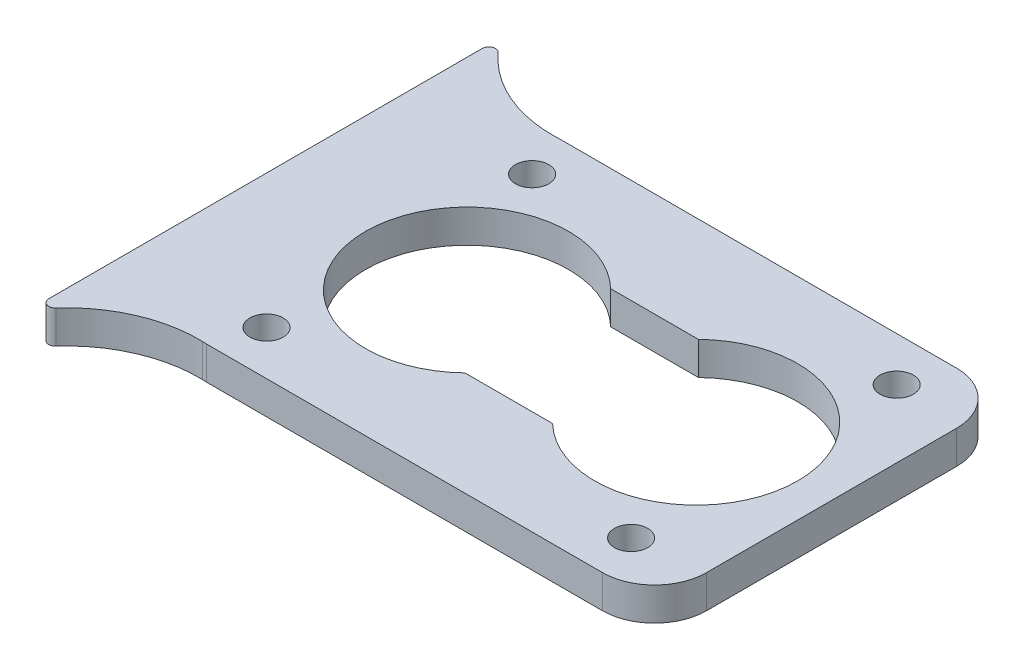
ISO-10303-21;
HEADER;
FILE_DESCRIPTION(('STEP AP214'),'2;1');
FILE_NAME('part.step','',(''),(''),'','','');
FILE_SCHEMA(('AUTOMOTIVE_DESIGN { 1 0 10303 214 1 1 1 1 }'));
ENDSEC;
DATA;
#1=APPLICATION_CONTEXT('core data for automotive mechanical design processes');
#2=APPLICATION_PROTOCOL_DEFINITION('international standard','automotive_design',2000,#1);
#3=PRODUCT_CONTEXT('',#1,'mechanical');
#4=PRODUCT('Part','Part','',(#3));
#5=PRODUCT_RELATED_PRODUCT_CATEGORY('part','',(#4));
#6=PRODUCT_DEFINITION_FORMATION('','',#4);
#7=PRODUCT_DEFINITION_CONTEXT('part definition',#1,'design');
#8=PRODUCT_DEFINITION('design','',#6,#7);
#9=PRODUCT_DEFINITION_SHAPE('','',#8);
#10=(LENGTH_UNIT() NAMED_UNIT(*) SI_UNIT(.MILLI.,.METRE.));
#11=(NAMED_UNIT(*) PLANE_ANGLE_UNIT() SI_UNIT($,.RADIAN.));
#12=(NAMED_UNIT(*) SI_UNIT($,.STERADIAN.) SOLID_ANGLE_UNIT());
#13=UNCERTAINTY_MEASURE_WITH_UNIT(LENGTH_MEASURE(1.E-05),#10,'distance_accuracy_value','');
#14=(GEOMETRIC_REPRESENTATION_CONTEXT(3) GLOBAL_UNCERTAINTY_ASSIGNED_CONTEXT((#13)) GLOBAL_UNIT_ASSIGNED_CONTEXT((#10,
#11,#12)) REPRESENTATION_CONTEXT('',''));
#15=CARTESIAN_POINT('',(0.,0.,0.));
#16=DIRECTION('',(0.,0.,1.));
#17=DIRECTION('',(1.,0.,0.));
#18=AXIS2_PLACEMENT_3D('',#15,#16,#17);
#19=CARTESIAN_POINT('',(-157.734622519799,3.175,-39.7034866419941));
#20=DIRECTION('',(0.,-1.,0.));
#21=DIRECTION('',(0.,0.,-1.));
#22=AXIS2_PLACEMENT_3D('',#19,#20,#21);
#23=CYLINDRICAL_SURFACE('',#22,5.);
#24=DIRECTION('',(0.,-1.,0.));
#25=VECTOR('',#24,1.);
#26=CARTESIAN_POINT('',(-158.159635896078,3.175,-34.7215830269105));
#27=LINE('',#26,#25);
#28=CARTESIAN_POINT('',(-158.159635896078,3.175,-34.7215830269105));
#29=VERTEX_POINT('',#28);
#30=CARTESIAN_POINT('',(-158.159635896078,0.,-34.7215830269105));
#31=VERTEX_POINT('',#30);
#32=EDGE_CURVE('E154',#29,#31,#27,.T.);
#33=ORIENTED_EDGE('',*,*,#32,.T.);
#34=CARTESIAN_POINT('',(-157.734622519799,0.,-39.7034866419941));
#35=DIRECTION('',(0.,1.,0.));
#36=DIRECTION('',(0.,0.,1.));
#37=AXIS2_PLACEMENT_3D('',#34,#35,#36);
#38=CIRCLE('',#37,5.);
#39=CARTESIAN_POINT('',(-157.734622519799,0.,-34.7034866419941));
#40=VERTEX_POINT('',#39);
#41=EDGE_CURVE('E160',#31,#40,#38,.T.);
#42=ORIENTED_EDGE('',*,*,#41,.T.);
#43=DIRECTION('',(0.,-1.,0.));
#44=VECTOR('',#43,1.);
#45=CARTESIAN_POINT('',(-157.734622519799,3.175,-34.7034866419941));
#46=LINE('',#45,#44);
#47=CARTESIAN_POINT('',(-157.734622519799,3.175,-34.7034866419941));
#48=VERTEX_POINT('',#47);
#49=EDGE_CURVE('E264',#48,#40,#46,.T.);
#50=ORIENTED_EDGE('',*,*,#49,.F.);
#51=CARTESIAN_POINT('',(-157.734622519799,3.175,-39.7034866419941));
#52=DIRECTION('',(0.,1.,0.));
#53=DIRECTION('',(0.,0.,1.));
#54=AXIS2_PLACEMENT_3D('',#51,#52,#53);
#55=CIRCLE('',#54,5.);
#56=EDGE_CURVE('E172',#29,#48,#55,.T.);
#57=ORIENTED_EDGE('',*,*,#56,.F.);
#58=EDGE_LOOP('',(#33,#42,#50,#57));
#59=FACE_BOUND('',#58,.T.);
#60=ADVANCED_FACE('F35',(#59),#23,.T.);
#61=CARTESIAN_POINT('',(-119.734622519799,3.175,-39.7034866419941));
#62=DIRECTION('',(0.,1.,0.));
#63=DIRECTION('',(0.,0.,1.));
#64=AXIS2_PLACEMENT_3D('',#61,#62,#63);
#65=PLANE('',#64);
#66=DIRECTION('',(-1.,0.,0.));
#67=VECTOR('',#66,1.);
#68=CARTESIAN_POINT('',(-142.94768653955,3.175,-58.7034866419942));
#69=LINE('',#68,#67);
#70=CARTESIAN_POINT('',(-134.521558500048,3.175,-58.7034866419942));
#71=VERTEX_POINT('',#70);
#72=CARTESIAN_POINT('',(-142.94768653955,3.175,-58.7034866419941));
#73=VERTEX_POINT('',#72);
#74=EDGE_CURVE('E208',#71,#73,#69,.T.);
#75=ORIENTED_EDGE('',*,*,#74,.F.);
#76=CARTESIAN_POINT('',(-127.734622519799,3.175,-51.7034866419941));
#77=DIRECTION('',(0.,1.,0.));
#78=DIRECTION('',(0.,0.,1.));
#79=AXIS2_PLACEMENT_3D('',#76,#77,#78);
#80=CIRCLE('',#79,9.75);
#81=CARTESIAN_POINT('',(-134.521558500048,3.175,-44.7034866419941));
#82=VERTEX_POINT('',#81);
#83=EDGE_CURVE('E206',#82,#71,#80,.T.);
#84=ORIENTED_EDGE('',*,*,#83,.F.);
#85=DIRECTION('',(1.,0.,0.));
#86=VECTOR('',#85,1.);
#87=CARTESIAN_POINT('',(-134.521558500048,3.175,-44.7034866419941));
#88=LINE('',#87,#86);
#89=CARTESIAN_POINT('',(-142.94768653955,3.175,-44.7034866419941));
#90=VERTEX_POINT('',#89);
#91=EDGE_CURVE('E213',#90,#82,#88,.T.);
#92=ORIENTED_EDGE('',*,*,#91,.F.);
#93=CARTESIAN_POINT('',(-149.734622519799,3.175,-51.7034866419941));
#94=DIRECTION('',(0.,1.,0.));
#95=DIRECTION('',(0.,0.,1.));
#96=AXIS2_PLACEMENT_3D('',#93,#94,#95);
#97=CIRCLE('',#96,9.74999999999999);
#98=EDGE_CURVE('E211',#73,#90,#97,.T.);
#99=ORIENTED_EDGE('',*,*,#98,.F.);
#100=EDGE_LOOP('',(#75,#84,#92,#99));
#101=FACE_BOUND('',#100,.T.);
#102=CARTESIAN_POINT('',(-158.487309476485,3.175,-81.3811623889611));
#103=DIRECTION('',(0.,-1.,0.));
#104=DIRECTION('',(0.,0.,-1.));
#105=AXIS2_PLACEMENT_3D('',#102,#103,#104);
#106=CIRCLE('',#105,12.7);
#107=CARTESIAN_POINT('',(-167.975226660594,3.175,-72.9390401731027));
#108=VERTEX_POINT('',#107);
#109=CARTESIAN_POINT('',(-158.159635896078,3.175,-68.6853902570779));
#110=VERTEX_POINT('',#109);
#111=EDGE_CURVE('E174',#108,#110,#106,.F.);
#112=ORIENTED_EDGE('',*,*,#111,.F.);
#113=CARTESIAN_POINT('',(-168.449622519799,3.175,-72.5169340623098));
#114=DIRECTION('',(0.,1.,0.));
#115=DIRECTION('',(0.,0.,1.));
#116=AXIS2_PLACEMENT_3D('',#113,#114,#115);
#117=CIRCLE('',#116,0.635);
#118=CARTESIAN_POINT('',(-169.084622519799,3.175,-72.5169340623098));
#119=VERTEX_POINT('',#118);
#120=EDGE_CURVE('E43',#108,#119,#117,.T.);
#121=ORIENTED_EDGE('',*,*,#120,.T.);
#122=DIRECTION('',(0.,0.,1.));
#123=VECTOR('',#122,1.);
#124=CARTESIAN_POINT('',(-169.084622519799,3.175,-1.03468456448365E-13));
#125=LINE('',#124,#123);
#126=CARTESIAN_POINT('',(-169.084622519799,3.175,-30.8900392216785));
#127=VERTEX_POINT('',#126);
#128=EDGE_CURVE('E179',#119,#127,#125,.T.);
#129=ORIENTED_EDGE('',*,*,#128,.T.);
#130=CARTESIAN_POINT('',(-168.449622519799,3.175,-30.8900392216785));
#131=DIRECTION('',(0.,1.,0.));
#132=DIRECTION('',(0.,0.,1.));
#133=AXIS2_PLACEMENT_3D('',#130,#131,#132);
#134=CIRCLE('',#133,0.635);
#135=CARTESIAN_POINT('',(-167.975226660594,3.175,-30.4679331108856));
#136=VERTEX_POINT('',#135);
#137=EDGE_CURVE('E50',#127,#136,#134,.T.);
#138=ORIENTED_EDGE('',*,*,#137,.T.);
#139=CARTESIAN_POINT('',(-158.487309476485,3.175,-22.0258108950272));
#140=DIRECTION('',(0.,-1.,0.));
#141=DIRECTION('',(0.,0.,-1.));
#142=AXIS2_PLACEMENT_3D('',#139,#140,#141);
#143=CIRCLE('',#142,12.7);
#144=EDGE_CURVE('E301',#136,#29,#143,.T.);
#145=ORIENTED_EDGE('',*,*,#144,.T.);
#146=ORIENTED_EDGE('',*,*,#56,.T.);
#147=DIRECTION('',(1.,0.,0.));
#148=VECTOR('',#147,1.);
#149=CARTESIAN_POINT('',(-157.734622519799,3.175,-34.7034866419941));
#150=LINE('',#149,#148);
#151=CARTESIAN_POINT('',(-119.734622519799,3.175,-34.7034866419941));
#152=VERTEX_POINT('',#151);
#153=EDGE_CURVE('E248',#48,#152,#150,.T.);
#154=ORIENTED_EDGE('',*,*,#153,.T.);
#155=CARTESIAN_POINT('',(-119.734622519799,3.175,-39.7034866419941));
#156=DIRECTION('',(0.,1.,0.));
#157=DIRECTION('',(0.,0.,1.));
#158=AXIS2_PLACEMENT_3D('',#155,#156,#157);
#159=CIRCLE('',#158,5.);
#160=CARTESIAN_POINT('',(-114.734622519799,3.175,-39.7034866419941));
#161=VERTEX_POINT('',#160);
#162=EDGE_CURVE('E235',#152,#161,#159,.T.);
#163=ORIENTED_EDGE('',*,*,#162,.T.);
#164=DIRECTION('',(0.,0.,-1.));
#165=VECTOR('',#164,1.);
#166=CARTESIAN_POINT('',(-114.734622519799,3.175,-39.7034866419941));
#167=LINE('',#166,#165);
#168=CARTESIAN_POINT('',(-114.734622519799,3.175,-63.7034866419941));
#169=VERTEX_POINT('',#168);
#170=EDGE_CURVE('E238',#161,#169,#167,.T.);
#171=ORIENTED_EDGE('',*,*,#170,.T.);
#172=CARTESIAN_POINT('',(-119.734622519799,3.175,-63.7034866419941));
#173=DIRECTION('',(0.,1.,0.));
#174=DIRECTION('',(0.,0.,1.));
#175=AXIS2_PLACEMENT_3D('',#172,#173,#174);
#176=CIRCLE('',#175,5.);
#177=CARTESIAN_POINT('',(-119.734622519799,3.175,-68.7034866419941));
#178=VERTEX_POINT('',#177);
#179=EDGE_CURVE('E240',#169,#178,#176,.T.);
#180=ORIENTED_EDGE('',*,*,#179,.T.);
#181=DIRECTION('',(-1.,0.,0.));
#182=VECTOR('',#181,1.);
#183=CARTESIAN_POINT('',(-119.734622519799,3.175,-68.7034866419941));
#184=LINE('',#183,#182);
#185=CARTESIAN_POINT('',(-157.734622519799,3.175,-68.7034866419941));
#186=VERTEX_POINT('',#185);
#187=EDGE_CURVE('E242',#178,#186,#184,.T.);
#188=ORIENTED_EDGE('',*,*,#187,.T.);
#189=CARTESIAN_POINT('',(-157.734622519799,3.175,-63.7034866419941));
#190=DIRECTION('',(0.,1.,0.));
#191=DIRECTION('',(0.,0.,1.));
#192=AXIS2_PLACEMENT_3D('',#189,#190,#191);
#193=CIRCLE('',#192,5.);
#194=EDGE_CURVE('E244',#186,#110,#193,.T.);
#195=ORIENTED_EDGE('',*,*,#194,.T.);
#196=EDGE_LOOP('',(#112,#121,#129,#138,#145,#146,#154,#163,#171,#180,#188,#195));
#197=FACE_BOUND('',#196,.T.);
#198=CARTESIAN_POINT('',(-156.234622519799,3.175,-64.4534866419941));
#199=DIRECTION('',(0.,1.,0.));
#200=DIRECTION('',(0.,0.,1.));
#201=AXIS2_PLACEMENT_3D('',#198,#199,#200);
#202=CIRCLE('',#201,1.60000000000002);
#203=CARTESIAN_POINT('',(-156.234622519799,3.175,-62.8534866419941));
#204=VERTEX_POINT('',#203);
#205=EDGE_CURVE('E188',#204,#204,#202,.T.);
#206=ORIENTED_EDGE('',*,*,#205,.F.);
#207=EDGE_LOOP('',(#206));
#208=FACE_BOUND('',#207,.T.);
#209=CARTESIAN_POINT('',(-121.234622519799,3.175,-64.4534866419941));
#210=DIRECTION('',(0.,1.,0.));
#211=DIRECTION('',(0.,0.,1.));
#212=AXIS2_PLACEMENT_3D('',#209,#210,#211);
#213=CIRCLE('',#212,1.59999999999999);
#214=CARTESIAN_POINT('',(-121.234622519799,3.175,-62.8534866419941));
#215=VERTEX_POINT('',#214);
#216=EDGE_CURVE('E177',#215,#215,#213,.T.);
#217=ORIENTED_EDGE('',*,*,#216,.F.);
#218=EDGE_LOOP('',(#217));
#219=FACE_BOUND('',#218,.T.);
#220=CARTESIAN_POINT('',(-156.234622519799,3.175,-38.9534866419942));
#221=DIRECTION('',(0.,1.,0.));
#222=DIRECTION('',(0.,0.,1.));
#223=AXIS2_PLACEMENT_3D('',#220,#221,#222);
#224=CIRCLE('',#223,1.60000000000002);
#225=CARTESIAN_POINT('',(-156.234622519799,3.175,-37.3534866419941));
#226=VERTEX_POINT('',#225);
#227=EDGE_CURVE('E194',#226,#226,#224,.T.);
#228=ORIENTED_EDGE('',*,*,#227,.F.);
#229=EDGE_LOOP('',(#228));
#230=FACE_BOUND('',#229,.T.);
#231=CARTESIAN_POINT('',(-121.234622519799,3.175,-38.9534866419942));
#232=DIRECTION('',(0.,1.,0.));
#233=DIRECTION('',(0.,0.,1.));
#234=AXIS2_PLACEMENT_3D('',#231,#232,#233);
#235=CIRCLE('',#234,1.60000000000002);
#236=CARTESIAN_POINT('',(-121.234622519799,3.175,-37.3534866419941));
#237=VERTEX_POINT('',#236);
#238=EDGE_CURVE('E200',#237,#237,#235,.T.);
#239=ORIENTED_EDGE('',*,*,#238,.F.);
#240=EDGE_LOOP('',(#239));
#241=FACE_BOUND('',#240,.T.);
#242=ADVANCED_FACE('F293',(#101,#197,#208,#219,#230,#241),#65,.T.);
#243=CARTESIAN_POINT('',(-119.734622519799,0.,-39.7034866419941));
#244=DIRECTION('',(0.,1.,0.));
#245=DIRECTION('',(0.,0.,1.));
#246=AXIS2_PLACEMENT_3D('',#243,#244,#245);
#247=PLANE('',#246);
#248=CARTESIAN_POINT('',(-127.734622519799,0.,-51.7034866419941));
#249=DIRECTION('',(0.,1.,0.));
#250=DIRECTION('',(0.,0.,1.));
#251=AXIS2_PLACEMENT_3D('',#248,#249,#250);
#252=CIRCLE('',#251,9.75);
#253=CARTESIAN_POINT('',(-134.521558500048,0.,-44.7034866419941));
#254=VERTEX_POINT('',#253);
#255=CARTESIAN_POINT('',(-134.521558500048,0.,-58.7034866419942));
#256=VERTEX_POINT('',#255);
#257=EDGE_CURVE('E203',#254,#256,#252,.T.);
#258=ORIENTED_EDGE('',*,*,#257,.T.);
#259=DIRECTION('',(-1.,0.,0.));
#260=VECTOR('',#259,1.);
#261=CARTESIAN_POINT('',(-142.94768653955,0.,-58.7034866419942));
#262=LINE('',#261,#260);
#263=CARTESIAN_POINT('',(-142.94768653955,0.,-58.7034866419941));
#264=VERTEX_POINT('',#263);
#265=EDGE_CURVE('E217',#256,#264,#262,.T.);
#266=ORIENTED_EDGE('',*,*,#265,.T.);
#267=CARTESIAN_POINT('',(-149.734622519799,0.,-51.7034866419941));
#268=DIRECTION('',(0.,1.,0.));
#269=DIRECTION('',(0.,0.,1.));
#270=AXIS2_PLACEMENT_3D('',#267,#268,#269);
#271=CIRCLE('',#270,9.74999999999999);
#272=CARTESIAN_POINT('',(-142.94768653955,0.,-44.7034866419941));
#273=VERTEX_POINT('',#272);
#274=EDGE_CURVE('E220',#264,#273,#271,.T.);
#275=ORIENTED_EDGE('',*,*,#274,.T.);
#276=DIRECTION('',(1.,0.,0.));
#277=VECTOR('',#276,1.);
#278=CARTESIAN_POINT('',(-134.521558500048,0.,-44.7034866419941));
#279=LINE('',#278,#277);
#280=EDGE_CURVE('E209',#273,#254,#279,.T.);
#281=ORIENTED_EDGE('',*,*,#280,.T.);
#282=EDGE_LOOP('',(#258,#266,#275,#281));
#283=FACE_BOUND('',#282,.T.);
#284=DIRECTION('',(0.,0.,1.));
#285=VECTOR('',#284,1.);
#286=CARTESIAN_POINT('',(-169.084622519799,0.,-1.03468456448365E-13));
#287=LINE('',#286,#285);
#288=CARTESIAN_POINT('',(-169.084622519799,0.,-72.5169340623098));
#289=VERTEX_POINT('',#288);
#290=CARTESIAN_POINT('',(-169.084622519799,0.,-30.8900392216785));
#291=VERTEX_POINT('',#290);
#292=EDGE_CURVE('E157',#289,#291,#287,.T.);
#293=ORIENTED_EDGE('',*,*,#292,.F.);
#294=CARTESIAN_POINT('',(-168.449622519799,0.,-72.5169340623098));
#295=DIRECTION('',(0.,1.,0.));
#296=DIRECTION('',(0.,0.,1.));
#297=AXIS2_PLACEMENT_3D('',#294,#295,#296);
#298=CIRCLE('',#297,0.635);
#299=CARTESIAN_POINT('',(-167.975226660594,0.,-72.9390401731027));
#300=VERTEX_POINT('',#299);
#301=EDGE_CURVE('E288',#289,#300,#298,.F.);
#302=ORIENTED_EDGE('',*,*,#301,.T.);
#303=CARTESIAN_POINT('',(-158.487309476485,0.,-81.3811623889611));
#304=DIRECTION('',(0.,-1.,0.));
#305=DIRECTION('',(0.,0.,-1.));
#306=AXIS2_PLACEMENT_3D('',#303,#304,#305);
#307=CIRCLE('',#306,12.7);
#308=CARTESIAN_POINT('',(-158.159635896078,0.,-68.6853902570779));
#309=VERTEX_POINT('',#308);
#310=EDGE_CURVE('E183',#300,#309,#307,.F.);
#311=ORIENTED_EDGE('',*,*,#310,.T.);
#312=CARTESIAN_POINT('',(-157.734622519799,0.,-63.7034866419941));
#313=DIRECTION('',(0.,1.,0.));
#314=DIRECTION('',(0.,0.,1.));
#315=AXIS2_PLACEMENT_3D('',#312,#313,#314);
#316=CIRCLE('',#315,5.);
#317=CARTESIAN_POINT('',(-157.734622519799,0.,-68.7034866419941));
#318=VERTEX_POINT('',#317);
#319=EDGE_CURVE('E169',#318,#309,#316,.T.);
#320=ORIENTED_EDGE('',*,*,#319,.F.);
#321=DIRECTION('',(-1.,0.,0.));
#322=VECTOR('',#321,1.);
#323=CARTESIAN_POINT('',(-119.734622519799,0.,-68.7034866419941));
#324=LINE('',#323,#322);
#325=CARTESIAN_POINT('',(-119.734622519799,0.,-68.7034866419941));
#326=VERTEX_POINT('',#325);
#327=EDGE_CURVE('E257',#326,#318,#324,.T.);
#328=ORIENTED_EDGE('',*,*,#327,.F.);
#329=CARTESIAN_POINT('',(-119.734622519799,0.,-63.7034866419941));
#330=DIRECTION('',(0.,1.,0.));
#331=DIRECTION('',(0.,0.,1.));
#332=AXIS2_PLACEMENT_3D('',#329,#330,#331);
#333=CIRCLE('',#332,5.);
#334=CARTESIAN_POINT('',(-114.734622519799,0.,-63.7034866419941));
#335=VERTEX_POINT('',#334);
#336=EDGE_CURVE('E255',#335,#326,#333,.T.);
#337=ORIENTED_EDGE('',*,*,#336,.F.);
#338=DIRECTION('',(0.,0.,-1.));
#339=VECTOR('',#338,1.);
#340=CARTESIAN_POINT('',(-114.734622519799,0.,-39.7034866419941));
#341=LINE('',#340,#339);
#342=CARTESIAN_POINT('',(-114.734622519799,0.,-39.7034866419941));
#343=VERTEX_POINT('',#342);
#344=EDGE_CURVE('E253',#343,#335,#341,.T.);
#345=ORIENTED_EDGE('',*,*,#344,.F.);
#346=CARTESIAN_POINT('',(-119.734622519799,0.,-39.7034866419941));
#347=DIRECTION('',(0.,1.,0.));
#348=DIRECTION('',(0.,0.,1.));
#349=AXIS2_PLACEMENT_3D('',#346,#347,#348);
#350=CIRCLE('',#349,5.);
#351=CARTESIAN_POINT('',(-119.734622519799,0.,-34.7034866419941));
#352=VERTEX_POINT('',#351);
#353=EDGE_CURVE('E234',#352,#343,#350,.T.);
#354=ORIENTED_EDGE('',*,*,#353,.F.);
#355=DIRECTION('',(1.,0.,0.));
#356=VECTOR('',#355,1.);
#357=CARTESIAN_POINT('',(-157.734622519799,0.,-34.7034866419941));
#358=LINE('',#357,#356);
#359=EDGE_CURVE('E165',#40,#352,#358,.T.);
#360=ORIENTED_EDGE('',*,*,#359,.F.);
#361=ORIENTED_EDGE('',*,*,#41,.F.);
#362=CARTESIAN_POINT('',(-158.487309476485,0.,-22.0258108950272));
#363=DIRECTION('',(0.,-1.,0.));
#364=DIRECTION('',(0.,0.,-1.));
#365=AXIS2_PLACEMENT_3D('',#362,#363,#364);
#366=CIRCLE('',#365,12.7);
#367=CARTESIAN_POINT('',(-167.975226660594,0.,-30.4679331108856));
#368=VERTEX_POINT('',#367);
#369=EDGE_CURVE('E150',#368,#31,#366,.T.);
#370=ORIENTED_EDGE('',*,*,#369,.F.);
#371=CARTESIAN_POINT('',(-168.449622519799,0.,-30.8900392216785));
#372=DIRECTION('',(0.,1.,0.));
#373=DIRECTION('',(0.,0.,1.));
#374=AXIS2_PLACEMENT_3D('',#371,#372,#373);
#375=CIRCLE('',#374,0.635);
#376=EDGE_CURVE('E286',#368,#291,#375,.F.);
#377=ORIENTED_EDGE('',*,*,#376,.T.);
#378=EDGE_LOOP('',(#293,#302,#311,#320,#328,#337,#345,#354,#360,#361,#370,#377));
#379=FACE_BOUND('',#378,.T.);
#380=CARTESIAN_POINT('',(-121.234622519799,0.,-64.4534866419941));
#381=DIRECTION('',(0.,1.,0.));
#382=DIRECTION('',(0.,0.,1.));
#383=AXIS2_PLACEMENT_3D('',#380,#381,#382);
#384=CIRCLE('',#383,1.59999999999999);
#385=CARTESIAN_POINT('',(-121.234622519799,0.,-62.8534866419941));
#386=VERTEX_POINT('',#385);
#387=EDGE_CURVE('E173',#386,#386,#384,.T.);
#388=ORIENTED_EDGE('',*,*,#387,.T.);
#389=EDGE_LOOP('',(#388));
#390=FACE_BOUND('',#389,.T.);
#391=CARTESIAN_POINT('',(-156.234622519799,0.,-64.4534866419941));
#392=DIRECTION('',(0.,1.,0.));
#393=DIRECTION('',(0.,0.,1.));
#394=AXIS2_PLACEMENT_3D('',#391,#392,#393);
#395=CIRCLE('',#394,1.60000000000002);
#396=CARTESIAN_POINT('',(-156.234622519799,0.,-62.8534866419941));
#397=VERTEX_POINT('',#396);
#398=EDGE_CURVE('E186',#397,#397,#395,.T.);
#399=ORIENTED_EDGE('',*,*,#398,.T.);
#400=EDGE_LOOP('',(#399));
#401=FACE_BOUND('',#400,.T.);
#402=CARTESIAN_POINT('',(-121.234622519799,0.,-38.9534866419942));
#403=DIRECTION('',(0.,1.,0.));
#404=DIRECTION('',(0.,0.,1.));
#405=AXIS2_PLACEMENT_3D('',#402,#403,#404);
#406=CIRCLE('',#405,1.60000000000002);
#407=CARTESIAN_POINT('',(-121.234622519799,0.,-37.3534866419941));
#408=VERTEX_POINT('',#407);
#409=EDGE_CURVE('E197',#408,#408,#406,.T.);
#410=ORIENTED_EDGE('',*,*,#409,.T.);
#411=EDGE_LOOP('',(#410));
#412=FACE_BOUND('',#411,.T.);
#413=CARTESIAN_POINT('',(-156.234622519799,0.,-38.9534866419942));
#414=DIRECTION('',(0.,1.,0.));
#415=DIRECTION('',(0.,0.,1.));
#416=AXIS2_PLACEMENT_3D('',#413,#414,#415);
#417=CIRCLE('',#416,1.60000000000002);
#418=CARTESIAN_POINT('',(-156.234622519799,0.,-37.3534866419941));
#419=VERTEX_POINT('',#418);
#420=EDGE_CURVE('E191',#419,#419,#417,.T.);
#421=ORIENTED_EDGE('',*,*,#420,.T.);
#422=EDGE_LOOP('',(#421));
#423=FACE_BOUND('',#422,.T.);
#424=ADVANCED_FACE('F162',(#283,#379,#390,#401,#412,#423),#247,.F.);
#425=CARTESIAN_POINT('',(-119.734622519799,3.175,-39.7034866419941));
#426=DIRECTION('',(0.,-1.,0.));
#427=DIRECTION('',(0.,0.,-1.));
#428=AXIS2_PLACEMENT_3D('',#425,#426,#427);
#429=CYLINDRICAL_SURFACE('',#428,5.);
#430=ORIENTED_EDGE('',*,*,#353,.T.);
#431=DIRECTION('',(0.,-1.,0.));
#432=VECTOR('',#431,1.);
#433=CARTESIAN_POINT('',(-114.734622519799,3.175,-39.7034866419941));
#434=LINE('',#433,#432);
#435=EDGE_CURVE('E275',#161,#343,#434,.T.);
#436=ORIENTED_EDGE('',*,*,#435,.F.);
#437=ORIENTED_EDGE('',*,*,#162,.F.);
#438=DIRECTION('',(0.,-1.,0.));
#439=VECTOR('',#438,1.);
#440=CARTESIAN_POINT('',(-119.734622519799,3.175,-34.7034866419941));
#441=LINE('',#440,#439);
#442=EDGE_CURVE('E250',#152,#352,#441,.T.);
#443=ORIENTED_EDGE('',*,*,#442,.T.);
#444=EDGE_LOOP('',(#430,#436,#437,#443));
#445=FACE_BOUND('',#444,.T.);
#446=ADVANCED_FACE('F339',(#445),#429,.T.);
#447=CARTESIAN_POINT('',(-114.734622519799,3.175,-39.7034866419941));
#448=DIRECTION('',(-1.,0.,0.));
#449=DIRECTION('',(0.,0.,1.));
#450=AXIS2_PLACEMENT_3D('',#447,#448,#449);
#451=PLANE('',#450);
#452=DIRECTION('',(0.,-1.,0.));
#453=VECTOR('',#452,1.);
#454=CARTESIAN_POINT('',(-114.734622519799,3.175,-63.7034866419941));
#455=LINE('',#454,#453);
#456=EDGE_CURVE('E272',#169,#335,#455,.T.);
#457=ORIENTED_EDGE('',*,*,#456,.F.);
#458=ORIENTED_EDGE('',*,*,#170,.F.);
#459=ORIENTED_EDGE('',*,*,#435,.T.);
#460=ORIENTED_EDGE('',*,*,#344,.T.);
#461=EDGE_LOOP('',(#457,#458,#459,#460));
#462=FACE_BOUND('',#461,.T.);
#463=ADVANCED_FACE('F335',(#462),#451,.F.);
#464=CARTESIAN_POINT('',(-119.734622519799,3.175,-63.7034866419941));
#465=DIRECTION('',(0.,-1.,0.));
#466=DIRECTION('',(0.,0.,-1.));
#467=AXIS2_PLACEMENT_3D('',#464,#465,#466);
#468=CYLINDRICAL_SURFACE('',#467,5.);
#469=ORIENTED_EDGE('',*,*,#336,.T.);
#470=DIRECTION('',(0.,-1.,0.));
#471=VECTOR('',#470,1.);
#472=CARTESIAN_POINT('',(-119.734622519799,3.175,-68.7034866419941));
#473=LINE('',#472,#471);
#474=EDGE_CURVE('E269',#178,#326,#473,.T.);
#475=ORIENTED_EDGE('',*,*,#474,.F.);
#476=ORIENTED_EDGE('',*,*,#179,.F.);
#477=ORIENTED_EDGE('',*,*,#456,.T.);
#478=EDGE_LOOP('',(#469,#475,#476,#477));
#479=FACE_BOUND('',#478,.T.);
#480=ADVANCED_FACE('F331',(#479),#468,.T.);
#481=CARTESIAN_POINT('',(-119.734622519799,3.175,-68.7034866419941));
#482=DIRECTION('',(0.,0.,1.));
#483=DIRECTION('',(1.,0.,0.));
#484=AXIS2_PLACEMENT_3D('',#481,#482,#483);
#485=PLANE('',#484);
#486=ORIENTED_EDGE('',*,*,#327,.T.);
#487=DIRECTION('',(0.,-1.,0.));
#488=VECTOR('',#487,1.);
#489=CARTESIAN_POINT('',(-157.734622519799,3.175,-68.7034866419941));
#490=LINE('',#489,#488);
#491=EDGE_CURVE('E266',#186,#318,#490,.T.);
#492=ORIENTED_EDGE('',*,*,#491,.F.);
#493=ORIENTED_EDGE('',*,*,#187,.F.);
#494=ORIENTED_EDGE('',*,*,#474,.T.);
#495=EDGE_LOOP('',(#486,#492,#493,#494));
#496=FACE_BOUND('',#495,.T.);
#497=ADVANCED_FACE('F327',(#496),#485,.F.);
#498=CARTESIAN_POINT('',(-157.734622519799,3.175,-63.7034866419941));
#499=DIRECTION('',(0.,-1.,0.));
#500=DIRECTION('',(0.,0.,-1.));
#501=AXIS2_PLACEMENT_3D('',#498,#499,#500);
#502=CYLINDRICAL_SURFACE('',#501,5.);
#503=ORIENTED_EDGE('',*,*,#319,.T.);
#504=DIRECTION('',(0.,-1.,0.));
#505=VECTOR('',#504,1.);
#506=CARTESIAN_POINT('',(-158.159635896078,1.5875,-68.6853902570779));
#507=LINE('',#506,#505);
#508=EDGE_CURVE('E278',#309,#110,#507,.F.);
#509=ORIENTED_EDGE('',*,*,#508,.T.);
#510=ORIENTED_EDGE('',*,*,#194,.F.);
#511=ORIENTED_EDGE('',*,*,#491,.T.);
#512=EDGE_LOOP('',(#503,#509,#510,#511));
#513=FACE_BOUND('',#512,.T.);
#514=ADVANCED_FACE('F324',(#513),#502,.T.);
#515=CARTESIAN_POINT('',(-157.734622519799,3.175,-34.7034866419941));
#516=DIRECTION('',(0.,0.,-1.));
#517=DIRECTION('',(-1.,0.,0.));
#518=AXIS2_PLACEMENT_3D('',#515,#516,#517);
#519=PLANE('',#518);
#520=ORIENTED_EDGE('',*,*,#359,.T.);
#521=ORIENTED_EDGE('',*,*,#442,.F.);
#522=ORIENTED_EDGE('',*,*,#153,.F.);
#523=ORIENTED_EDGE('',*,*,#49,.T.);
#524=EDGE_LOOP('',(#520,#521,#522,#523));
#525=FACE_BOUND('',#524,.T.);
#526=ADVANCED_FACE('F322',(#525),#519,.F.);
#527=CARTESIAN_POINT('',(-127.734622519799,3.175,-51.7034866419941));
#528=DIRECTION('',(0.,-1.,0.));
#529=DIRECTION('',(0.,0.,-1.));
#530=AXIS2_PLACEMENT_3D('',#527,#528,#529);
#531=CYLINDRICAL_SURFACE('',#530,9.75);
#532=DIRECTION('',(0.,-1.,0.));
#533=VECTOR('',#532,1.);
#534=CARTESIAN_POINT('',(-134.521558500048,3.175,-58.7034866419942));
#535=LINE('',#534,#533);
#536=EDGE_CURVE('E231',#71,#256,#535,.T.);
#537=ORIENTED_EDGE('',*,*,#536,.T.);
#538=ORIENTED_EDGE('',*,*,#257,.F.);
#539=DIRECTION('',(0.,-1.,0.));
#540=VECTOR('',#539,1.);
#541=CARTESIAN_POINT('',(-134.521558500048,3.175,-44.7034866419941));
#542=LINE('',#541,#540);
#543=EDGE_CURVE('E215',#82,#254,#542,.T.);
#544=ORIENTED_EDGE('',*,*,#543,.F.);
#545=ORIENTED_EDGE('',*,*,#83,.T.);
#546=EDGE_LOOP('',(#537,#538,#544,#545));
#547=FACE_BOUND('',#546,.T.);
#548=ADVANCED_FACE('F357',(#547),#531,.F.);
#549=CARTESIAN_POINT('',(-142.94768653955,3.175,-58.7034866419942));
#550=DIRECTION('',(0.,0.,1.));
#551=DIRECTION('',(1.,0.,0.));
#552=AXIS2_PLACEMENT_3D('',#549,#550,#551);
#553=PLANE('',#552);
#554=ORIENTED_EDGE('',*,*,#265,.F.);
#555=ORIENTED_EDGE('',*,*,#536,.F.);
#556=ORIENTED_EDGE('',*,*,#74,.T.);
#557=DIRECTION('',(0.,-1.,0.));
#558=VECTOR('',#557,1.);
#559=CARTESIAN_POINT('',(-142.94768653955,3.175,-58.7034866419941));
#560=LINE('',#559,#558);
#561=EDGE_CURVE('E228',#73,#264,#560,.T.);
#562=ORIENTED_EDGE('',*,*,#561,.T.);
#563=EDGE_LOOP('',(#554,#555,#556,#562));
#564=FACE_BOUND('',#563,.T.);
#565=ADVANCED_FACE('F361',(#564),#553,.T.);
#566=CARTESIAN_POINT('',(-149.734622519799,3.175,-51.7034866419941));
#567=DIRECTION('',(0.,-1.,0.));
#568=DIRECTION('',(0.,0.,-1.));
#569=AXIS2_PLACEMENT_3D('',#566,#567,#568);
#570=CYLINDRICAL_SURFACE('',#569,9.74999999999999);
#571=ORIENTED_EDGE('',*,*,#98,.T.);
#572=DIRECTION('',(0.,-1.,0.));
#573=VECTOR('',#572,1.);
#574=CARTESIAN_POINT('',(-142.94768653955,3.175,-44.7034866419941));
#575=LINE('',#574,#573);
#576=EDGE_CURVE('E225',#90,#273,#575,.T.);
#577=ORIENTED_EDGE('',*,*,#576,.T.);
#578=ORIENTED_EDGE('',*,*,#274,.F.);
#579=ORIENTED_EDGE('',*,*,#561,.F.);
#580=EDGE_LOOP('',(#571,#577,#578,#579));
#581=FACE_BOUND('',#580,.T.);
#582=ADVANCED_FACE('F367',(#581),#570,.F.);
#583=CARTESIAN_POINT('',(-134.521558500048,3.175,-44.7034866419941));
#584=DIRECTION('',(0.,0.,-1.));
#585=DIRECTION('',(-1.,0.,0.));
#586=AXIS2_PLACEMENT_3D('',#583,#584,#585);
#587=PLANE('',#586);
#588=ORIENTED_EDGE('',*,*,#280,.F.);
#589=ORIENTED_EDGE('',*,*,#576,.F.);
#590=ORIENTED_EDGE('',*,*,#91,.T.);
#591=ORIENTED_EDGE('',*,*,#543,.T.);
#592=EDGE_LOOP('',(#588,#589,#590,#591));
#593=FACE_BOUND('',#592,.T.);
#594=ADVANCED_FACE('F373',(#593),#587,.T.);
#595=CARTESIAN_POINT('',(-121.234622519799,3.175,-38.9534866419942));
#596=DIRECTION('',(0.,-1.,0.));
#597=DIRECTION('',(0.,0.,-1.));
#598=AXIS2_PLACEMENT_3D('',#595,#596,#597);
#599=CYLINDRICAL_SURFACE('',#598,1.60000000000002);
#600=ORIENTED_EDGE('',*,*,#409,.F.);
#601=EDGE_LOOP('',(#600));
#602=FACE_BOUND('',#601,.T.);
#603=ORIENTED_EDGE('',*,*,#238,.T.);
#604=EDGE_LOOP('',(#603));
#605=FACE_BOUND('',#604,.T.);
#606=ADVANCED_FACE('F377',(#602,#605),#599,.F.);
#607=CARTESIAN_POINT('',(-156.234622519799,3.175,-38.9534866419942));
#608=DIRECTION('',(0.,-1.,0.));
#609=DIRECTION('',(0.,0.,-1.));
#610=AXIS2_PLACEMENT_3D('',#607,#608,#609);
#611=CYLINDRICAL_SURFACE('',#610,1.60000000000002);
#612=ORIENTED_EDGE('',*,*,#420,.F.);
#613=EDGE_LOOP('',(#612));
#614=FACE_BOUND('',#613,.T.);
#615=ORIENTED_EDGE('',*,*,#227,.T.);
#616=EDGE_LOOP('',(#615));
#617=FACE_BOUND('',#616,.T.);
#618=ADVANCED_FACE('F381',(#614,#617),#611,.F.);
#619=CARTESIAN_POINT('',(-156.234622519799,3.175,-64.4534866419941));
#620=DIRECTION('',(0.,-1.,0.));
#621=DIRECTION('',(0.,0.,-1.));
#622=AXIS2_PLACEMENT_3D('',#619,#620,#621);
#623=CYLINDRICAL_SURFACE('',#622,1.60000000000002);
#624=ORIENTED_EDGE('',*,*,#398,.F.);
#625=EDGE_LOOP('',(#624));
#626=FACE_BOUND('',#625,.T.);
#627=ORIENTED_EDGE('',*,*,#205,.T.);
#628=EDGE_LOOP('',(#627));
#629=FACE_BOUND('',#628,.T.);
#630=ADVANCED_FACE('F385',(#626,#629),#623,.F.);
#631=CARTESIAN_POINT('',(-121.234622519799,3.175,-64.4534866419941));
#632=DIRECTION('',(0.,-1.,0.));
#633=DIRECTION('',(0.,0.,-1.));
#634=AXIS2_PLACEMENT_3D('',#631,#632,#633);
#635=CYLINDRICAL_SURFACE('',#634,1.59999999999999);
#636=ORIENTED_EDGE('',*,*,#387,.F.);
#637=EDGE_LOOP('',(#636));
#638=FACE_BOUND('',#637,.T.);
#639=ORIENTED_EDGE('',*,*,#216,.T.);
#640=EDGE_LOOP('',(#639));
#641=FACE_BOUND('',#640,.T.);
#642=ADVANCED_FACE('F389',(#638,#641),#635,.F.);
#643=CARTESIAN_POINT('',(-158.487309476485,3.175,-81.3811623889611));
#644=DIRECTION('',(0.,-1.,0.));
#645=DIRECTION('',(0.,0.,-1.));
#646=AXIS2_PLACEMENT_3D('',#643,#644,#645);
#647=CYLINDRICAL_SURFACE('',#646,12.7);
#648=ORIENTED_EDGE('',*,*,#310,.F.);
#649=DIRECTION('',(0.,-1.,0.));
#650=VECTOR('',#649,1.);
#651=CARTESIAN_POINT('',(-167.975226660594,3.175,-72.9390401731027));
#652=LINE('',#651,#650);
#653=EDGE_CURVE('E58',#300,#108,#652,.F.);
#654=ORIENTED_EDGE('',*,*,#653,.T.);
#655=ORIENTED_EDGE('',*,*,#111,.T.);
#656=ORIENTED_EDGE('',*,*,#508,.F.);
#657=EDGE_LOOP('',(#648,#654,#655,#656));
#658=FACE_BOUND('',#657,.T.);
#659=ADVANCED_FACE('F306',(#658),#647,.F.);
#660=CARTESIAN_POINT('',(-169.084622519799,3.175,-1.03468456448365E-13));
#661=DIRECTION('',(1.,0.,0.));
#662=DIRECTION('',(0.,0.,-1.));
#663=AXIS2_PLACEMENT_3D('',#660,#661,#662);
#664=PLANE('',#663);
#665=ORIENTED_EDGE('',*,*,#128,.F.);
#666=DIRECTION('',(0.,1.,0.));
#667=VECTOR('',#666,1.);
#668=CARTESIAN_POINT('',(-169.084622519799,0.,-72.5169340623098));
#669=LINE('',#668,#667);
#670=EDGE_CURVE('E283',#119,#289,#669,.F.);
#671=ORIENTED_EDGE('',*,*,#670,.T.);
#672=ORIENTED_EDGE('',*,*,#292,.T.);
#673=DIRECTION('',(0.,-1.,0.));
#674=VECTOR('',#673,1.);
#675=CARTESIAN_POINT('',(-169.084622519799,3.175,-30.8900392216785));
#676=LINE('',#675,#674);
#677=EDGE_CURVE('E281',#291,#127,#676,.F.);
#678=ORIENTED_EDGE('',*,*,#677,.T.);
#679=EDGE_LOOP('',(#665,#671,#672,#678));
#680=FACE_BOUND('',#679,.T.);
#681=ADVANCED_FACE('F298',(#680),#664,.F.);
#682=CARTESIAN_POINT('',(-158.487309476485,3.175,-22.0258108950272));
#683=DIRECTION('',(0.,-1.,0.));
#684=DIRECTION('',(0.,0.,-1.));
#685=AXIS2_PLACEMENT_3D('',#682,#683,#684);
#686=CYLINDRICAL_SURFACE('',#685,12.7);
#687=ORIENTED_EDGE('',*,*,#144,.F.);
#688=DIRECTION('',(0.,-1.,0.));
#689=VECTOR('',#688,1.);
#690=CARTESIAN_POINT('',(-167.975226660594,3.175,-30.4679331108856));
#691=LINE('',#690,#689);
#692=EDGE_CURVE('E11',#136,#368,#691,.T.);
#693=ORIENTED_EDGE('',*,*,#692,.T.);
#694=ORIENTED_EDGE('',*,*,#369,.T.);
#695=ORIENTED_EDGE('',*,*,#32,.F.);
#696=EDGE_LOOP('',(#687,#693,#694,#695));
#697=FACE_BOUND('',#696,.T.);
#698=ADVANCED_FACE('F152',(#697),#686,.F.);
#699=CARTESIAN_POINT('',(-168.449622519799,3.175,-72.5169340623098));
#700=DIRECTION('',(0.,-1.,0.));
#701=DIRECTION('',(0.,0.,-1.));
#702=AXIS2_PLACEMENT_3D('',#699,#700,#701);
#703=CYLINDRICAL_SURFACE('',#702,0.635);
#704=ORIENTED_EDGE('',*,*,#120,.F.);
#705=ORIENTED_EDGE('',*,*,#653,.F.);
#706=ORIENTED_EDGE('',*,*,#301,.F.);
#707=ORIENTED_EDGE('',*,*,#670,.F.);
#708=EDGE_LOOP('',(#704,#705,#706,#707));
#709=FACE_BOUND('',#708,.T.);
#710=ADVANCED_FACE('F303',(#709),#703,.T.);
#711=CARTESIAN_POINT('',(-168.449622519799,3.175,-30.8900392216785));
#712=DIRECTION('',(0.,-1.,0.));
#713=DIRECTION('',(0.,0.,-1.));
#714=AXIS2_PLACEMENT_3D('',#711,#712,#713);
#715=CYLINDRICAL_SURFACE('',#714,0.635);
#716=ORIENTED_EDGE('',*,*,#137,.F.);
#717=ORIENTED_EDGE('',*,*,#677,.F.);
#718=ORIENTED_EDGE('',*,*,#376,.F.);
#719=ORIENTED_EDGE('',*,*,#692,.F.);
#720=EDGE_LOOP('',(#716,#717,#718,#719));
#721=FACE_BOUND('',#720,.T.);
#722=ADVANCED_FACE('F37',(#721),#715,.T.);
#723=CLOSED_SHELL('',(#60,#242,#424,#446,#463,#480,#497,#514,#526,#548,#565,#582,#594,#606,#618,
#630,#642,#659,#681,#698,#710,#722));
#724=MANIFOLD_SOLID_BREP('B2',#723);
#725=ADVANCED_BREP_SHAPE_REPRESENTATION('',(#18,#724),#14);
#726=SHAPE_DEFINITION_REPRESENTATION(#9,#725);
ENDSEC;
END-ISO-10303-21;
